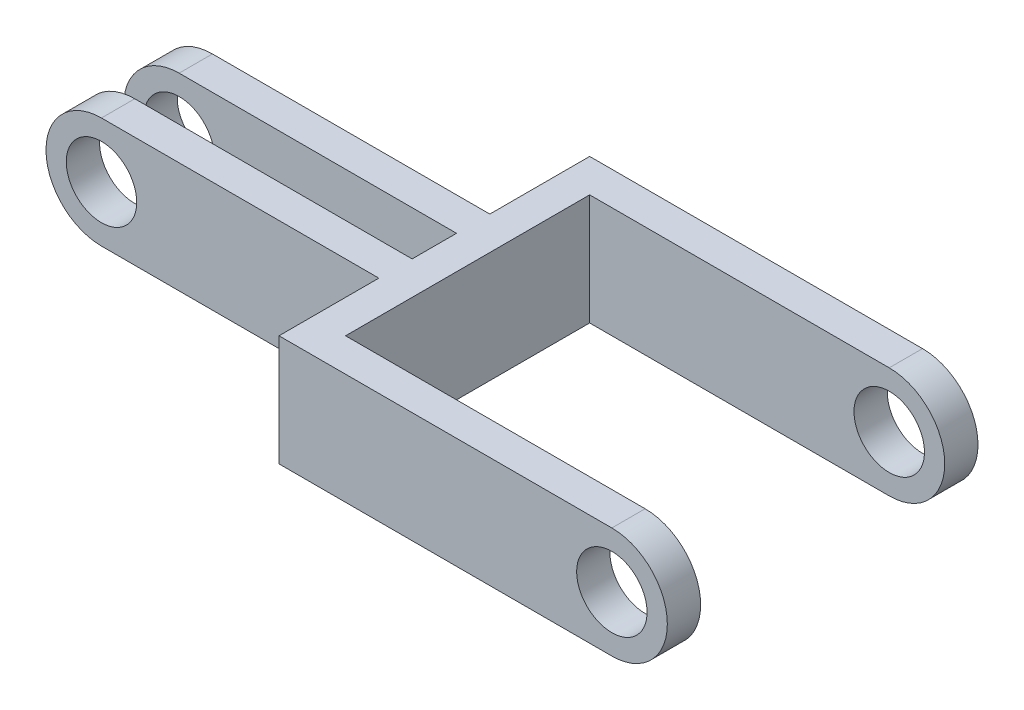
ISO-10303-21;
HEADER;
FILE_DESCRIPTION(('STEP AP214'),'2;1');
FILE_NAME('part.step','',(''),(''),'','','');
FILE_SCHEMA(('AUTOMOTIVE_DESIGN { 1 0 10303 214 1 1 1 1 }'));
ENDSEC;
DATA;
#1=APPLICATION_CONTEXT('core data for automotive mechanical design processes');
#2=APPLICATION_PROTOCOL_DEFINITION('international standard','automotive_design',2000,#1);
#3=PRODUCT_CONTEXT('',#1,'mechanical');
#4=PRODUCT('Part','Part','',(#3));
#5=PRODUCT_RELATED_PRODUCT_CATEGORY('part','',(#4));
#6=PRODUCT_DEFINITION_FORMATION('','',#4);
#7=PRODUCT_DEFINITION_CONTEXT('part definition',#1,'design');
#8=PRODUCT_DEFINITION('design','',#6,#7);
#9=PRODUCT_DEFINITION_SHAPE('','',#8);
#10=(LENGTH_UNIT() NAMED_UNIT(*) SI_UNIT(.MILLI.,.METRE.));
#11=(NAMED_UNIT(*) PLANE_ANGLE_UNIT() SI_UNIT($,.RADIAN.));
#12=(NAMED_UNIT(*) SI_UNIT($,.STERADIAN.) SOLID_ANGLE_UNIT());
#13=UNCERTAINTY_MEASURE_WITH_UNIT(LENGTH_MEASURE(1.E-05),#10,'distance_accuracy_value','');
#14=(GEOMETRIC_REPRESENTATION_CONTEXT(3) GLOBAL_UNCERTAINTY_ASSIGNED_CONTEXT((#13)) GLOBAL_UNIT_ASSIGNED_CONTEXT((#10,
#11,#12)) REPRESENTATION_CONTEXT('',''));
#15=CARTESIAN_POINT('',(0.,0.,0.));
#16=DIRECTION('',(0.,0.,1.));
#17=DIRECTION('',(1.,0.,0.));
#18=AXIS2_PLACEMENT_3D('',#15,#16,#17);
#19=CARTESIAN_POINT('',(25.,-8.54400374531753,3.));
#20=DIRECTION('',(-1.,0.,0.));
#21=DIRECTION('',(0.,0.,1.));
#22=AXIS2_PLACEMENT_3D('',#19,#20,#21);
#23=PLANE('',#22);
#24=DIRECTION('',(0.,0.,1.));
#25=VECTOR('',#24,1.);
#26=CARTESIAN_POINT('',(25.,10.,3.));
#27=LINE('',#26,#25);
#28=CARTESIAN_POINT('',(25.,10.,10.));
#29=VERTEX_POINT('',#28);
#30=CARTESIAN_POINT('',(25.,10.,19.));
#31=VERTEX_POINT('',#30);
#32=EDGE_CURVE('E225',#29,#31,#27,.T.);
#33=ORIENTED_EDGE('',*,*,#32,.F.);
#34=DIRECTION('',(0.,1.,0.));
#35=VECTOR('',#34,1.);
#36=CARTESIAN_POINT('',(25.,10.,10.));
#37=LINE('',#36,#35);
#38=CARTESIAN_POINT('',(25.,0.,10.));
#39=VERTEX_POINT('',#38);
#40=EDGE_CURVE('E219',#39,#29,#37,.T.);
#41=ORIENTED_EDGE('',*,*,#40,.F.);
#42=DIRECTION('',(0.,0.,-1.));
#43=VECTOR('',#42,1.);
#44=CARTESIAN_POINT('',(25.,0.,3.));
#45=LINE('',#44,#43);
#46=CARTESIAN_POINT('',(25.,0.,19.));
#47=VERTEX_POINT('',#46);
#48=EDGE_CURVE('E226',#47,#39,#45,.T.);
#49=ORIENTED_EDGE('',*,*,#48,.F.);
#50=DIRECTION('',(0.,1.,0.));
#51=VECTOR('',#50,1.);
#52=CARTESIAN_POINT('',(25.,0.,19.));
#53=LINE('',#52,#51);
#54=EDGE_CURVE('E160',#47,#31,#53,.T.);
#55=ORIENTED_EDGE('',*,*,#54,.T.);
#56=EDGE_LOOP('',(#33,#41,#49,#55));
#57=FACE_BOUND('',#56,.T.);
#58=ADVANCED_FACE('F35',(#57),#23,.T.);
#59=CARTESIAN_POINT('',(0.,5.,3.));
#60=DIRECTION('',(0.,0.,1.));
#61=DIRECTION('',(1.,0.,0.));
#62=AXIS2_PLACEMENT_3D('',#59,#60,#61);
#63=PLANE('',#62);
#64=CARTESIAN_POINT('',(0.,5.,3.));
#65=DIRECTION('',(0.,0.,1.));
#66=DIRECTION('',(1.,0.,0.));
#67=AXIS2_PLACEMENT_3D('',#64,#65,#66);
#68=CIRCLE('',#67,3.175);
#69=CARTESIAN_POINT('',(3.175,5.,3.));
#70=VERTEX_POINT('',#69);
#71=EDGE_CURVE('E275',#70,#70,#68,.T.);
#72=ORIENTED_EDGE('',*,*,#71,.F.);
#73=EDGE_LOOP('',(#72));
#74=FACE_BOUND('',#73,.T.);
#75=DIRECTION('',(1.,0.,0.));
#76=VECTOR('',#75,1.);
#77=CARTESIAN_POINT('',(0.,0.,3.));
#78=LINE('',#77,#76);
#79=CARTESIAN_POINT('',(0.,0.,3.));
#80=VERTEX_POINT('',#79);
#81=CARTESIAN_POINT('',(25.,0.,3.));
#82=VERTEX_POINT('',#81);
#83=EDGE_CURVE('E284',#80,#82,#78,.T.);
#84=ORIENTED_EDGE('',*,*,#83,.T.);
#85=DIRECTION('',(0.,1.,0.));
#86=VECTOR('',#85,1.);
#87=CARTESIAN_POINT('',(25.,-8.54400374531753,3.));
#88=LINE('',#87,#86);
#89=CARTESIAN_POINT('',(25.,10.,3.));
#90=VERTEX_POINT('',#89);
#91=EDGE_CURVE('E231',#82,#90,#88,.T.);
#92=ORIENTED_EDGE('',*,*,#91,.T.);
#93=DIRECTION('',(-1.,0.,0.));
#94=VECTOR('',#93,1.);
#95=CARTESIAN_POINT('',(0.,10.,3.));
#96=LINE('',#95,#94);
#97=CARTESIAN_POINT('',(0.,10.,3.));
#98=VERTEX_POINT('',#97);
#99=EDGE_CURVE('E288',#90,#98,#96,.T.);
#100=ORIENTED_EDGE('',*,*,#99,.T.);
#101=CARTESIAN_POINT('',(0.,5.,3.));
#102=DIRECTION('',(0.,0.,1.));
#103=DIRECTION('',(1.,0.,0.));
#104=AXIS2_PLACEMENT_3D('',#101,#102,#103);
#105=CIRCLE('',#104,5.);
#106=EDGE_CURVE('E281',#98,#80,#105,.T.);
#107=ORIENTED_EDGE('',*,*,#106,.T.);
#108=EDGE_LOOP('',(#84,#92,#100,#107));
#109=FACE_BOUND('',#108,.T.);
#110=ADVANCED_FACE('F313',(#74,#109),#63,.T.);
#111=CARTESIAN_POINT('',(0.,5.,0.));
#112=DIRECTION('',(0.,0.,1.));
#113=DIRECTION('',(1.,0.,0.));
#114=AXIS2_PLACEMENT_3D('',#111,#112,#113);
#115=PLANE('',#114);
#116=CARTESIAN_POINT('',(0.,5.,0.));
#117=DIRECTION('',(0.,0.,1.));
#118=DIRECTION('',(1.,0.,0.));
#119=AXIS2_PLACEMENT_3D('',#116,#117,#118);
#120=CIRCLE('',#119,5.);
#121=CARTESIAN_POINT('',(0.,10.,0.));
#122=VERTEX_POINT('',#121);
#123=CARTESIAN_POINT('',(0.,0.,0.));
#124=VERTEX_POINT('',#123);
#125=EDGE_CURVE('E278',#122,#124,#120,.T.);
#126=ORIENTED_EDGE('',*,*,#125,.F.);
#127=DIRECTION('',(-1.,0.,0.));
#128=VECTOR('',#127,1.);
#129=CARTESIAN_POINT('',(0.,10.,0.));
#130=LINE('',#129,#128);
#131=CARTESIAN_POINT('',(25.,10.,0.));
#132=VERTEX_POINT('',#131);
#133=EDGE_CURVE('E285',#132,#122,#130,.T.);
#134=ORIENTED_EDGE('',*,*,#133,.F.);
#135=DIRECTION('',(0.,1.,0.));
#136=VECTOR('',#135,1.);
#137=CARTESIAN_POINT('',(25.,10.,0.));
#138=LINE('',#137,#136);
#139=CARTESIAN_POINT('',(25.,0.,0.));
#140=VERTEX_POINT('',#139);
#141=EDGE_CURVE('E294',#140,#132,#138,.T.);
#142=ORIENTED_EDGE('',*,*,#141,.F.);
#143=DIRECTION('',(1.,0.,0.));
#144=VECTOR('',#143,1.);
#145=CARTESIAN_POINT('',(0.,0.,0.));
#146=LINE('',#145,#144);
#147=EDGE_CURVE('E292',#124,#140,#146,.T.);
#148=ORIENTED_EDGE('',*,*,#147,.F.);
#149=EDGE_LOOP('',(#126,#134,#142,#148));
#150=FACE_BOUND('',#149,.T.);
#151=CARTESIAN_POINT('',(0.,5.,0.));
#152=DIRECTION('',(0.,0.,1.));
#153=DIRECTION('',(1.,0.,0.));
#154=AXIS2_PLACEMENT_3D('',#151,#152,#153);
#155=CIRCLE('',#154,3.175);
#156=CARTESIAN_POINT('',(3.175,5.,0.));
#157=VERTEX_POINT('',#156);
#158=EDGE_CURVE('E272',#157,#157,#155,.T.);
#159=ORIENTED_EDGE('',*,*,#158,.T.);
#160=EDGE_LOOP('',(#159));
#161=FACE_BOUND('',#160,.T.);
#162=ADVANCED_FACE('F307',(#150,#161),#115,.F.);
#163=CARTESIAN_POINT('',(0.,5.,3.));
#164=DIRECTION('',(0.,0.,-1.));
#165=DIRECTION('',(-1.,0.,0.));
#166=AXIS2_PLACEMENT_3D('',#163,#164,#165);
#167=CYLINDRICAL_SURFACE('',#166,5.);
#168=ORIENTED_EDGE('',*,*,#125,.T.);
#169=DIRECTION('',(0.,0.,-1.));
#170=VECTOR('',#169,1.);
#171=CARTESIAN_POINT('',(0.,0.,3.));
#172=LINE('',#171,#170);
#173=EDGE_CURVE('E11',#80,#124,#172,.T.);
#174=ORIENTED_EDGE('',*,*,#173,.F.);
#175=ORIENTED_EDGE('',*,*,#106,.F.);
#176=DIRECTION('',(0.,0.,-1.));
#177=VECTOR('',#176,1.);
#178=CARTESIAN_POINT('',(0.,10.,3.));
#179=LINE('',#178,#177);
#180=EDGE_CURVE('E43',#98,#122,#179,.T.);
#181=ORIENTED_EDGE('',*,*,#180,.T.);
#182=EDGE_LOOP('',(#168,#174,#175,#181));
#183=FACE_BOUND('',#182,.T.);
#184=ADVANCED_FACE('F37',(#183),#167,.T.);
#185=CARTESIAN_POINT('',(0.,0.,3.));
#186=DIRECTION('',(0.,1.,0.));
#187=DIRECTION('',(0.,0.,1.));
#188=AXIS2_PLACEMENT_3D('',#185,#186,#187);
#189=PLANE('',#188);
#190=DIRECTION('',(0.,0.,-1.));
#191=VECTOR('',#190,1.);
#192=CARTESIAN_POINT('',(25.,0.,3.));
#193=LINE('',#192,#191);
#194=CARTESIAN_POINT('',(25.,0.,-9.));
#195=VERTEX_POINT('',#194);
#196=EDGE_CURVE('E263',#140,#195,#193,.T.);
#197=ORIENTED_EDGE('',*,*,#196,.T.);
#198=DIRECTION('',(-1.,0.,0.));
#199=VECTOR('',#198,1.);
#200=CARTESIAN_POINT('',(25.,0.,-9.));
#201=LINE('',#200,#199);
#202=CARTESIAN_POINT('',(55.,0.,-9.));
#203=VERTEX_POINT('',#202);
#204=EDGE_CURVE('E251',#203,#195,#201,.T.);
#205=ORIENTED_EDGE('',*,*,#204,.F.);
#206=DIRECTION('',(0.,0.,1.));
#207=VECTOR('',#206,1.);
#208=CARTESIAN_POINT('',(55.,0.,-9.));
#209=LINE('',#208,#207);
#210=CARTESIAN_POINT('',(55.,0.,-6.));
#211=VERTEX_POINT('',#210);
#212=EDGE_CURVE('E254',#203,#211,#209,.T.);
#213=ORIENTED_EDGE('',*,*,#212,.T.);
#214=DIRECTION('',(-1.,0.,0.));
#215=VECTOR('',#214,1.);
#216=CARTESIAN_POINT('',(25.,0.,-6.));
#217=LINE('',#216,#215);
#218=CARTESIAN_POINT('',(28.,0.,-6.));
#219=VERTEX_POINT('',#218);
#220=EDGE_CURVE('E249',#211,#219,#217,.T.);
#221=ORIENTED_EDGE('',*,*,#220,.T.);
#222=DIRECTION('',(0.,0.,-1.));
#223=VECTOR('',#222,1.);
#224=CARTESIAN_POINT('',(28.,0.,3.));
#225=LINE('',#224,#223);
#226=CARTESIAN_POINT('',(28.,0.,16.));
#227=VERTEX_POINT('',#226);
#228=EDGE_CURVE('E264',#227,#219,#225,.T.);
#229=ORIENTED_EDGE('',*,*,#228,.F.);
#230=DIRECTION('',(-1.,0.,0.));
#231=VECTOR('',#230,1.);
#232=CARTESIAN_POINT('',(25.,0.,16.));
#233=LINE('',#232,#231);
#234=CARTESIAN_POINT('',(55.,0.,16.));
#235=VERTEX_POINT('',#234);
#236=EDGE_CURVE('E169',#235,#227,#233,.T.);
#237=ORIENTED_EDGE('',*,*,#236,.F.);
#238=DIRECTION('',(0.,0.,-1.));
#239=VECTOR('',#238,1.);
#240=CARTESIAN_POINT('',(55.,0.,19.));
#241=LINE('',#240,#239);
#242=CARTESIAN_POINT('',(55.,0.,19.));
#243=VERTEX_POINT('',#242);
#244=EDGE_CURVE('E166',#243,#235,#241,.T.);
#245=ORIENTED_EDGE('',*,*,#244,.F.);
#246=DIRECTION('',(-1.,0.,0.));
#247=VECTOR('',#246,1.);
#248=CARTESIAN_POINT('',(25.,0.,19.));
#249=LINE('',#248,#247);
#250=EDGE_CURVE('E153',#243,#47,#249,.T.);
#251=ORIENTED_EDGE('',*,*,#250,.T.);
#252=ORIENTED_EDGE('',*,*,#48,.T.);
#253=DIRECTION('',(1.,0.,0.));
#254=VECTOR('',#253,1.);
#255=CARTESIAN_POINT('',(0.,0.,10.));
#256=LINE('',#255,#254);
#257=CARTESIAN_POINT('',(0.,0.,10.));
#258=VERTEX_POINT('',#257);
#259=EDGE_CURVE('E50',#258,#39,#256,.T.);
#260=ORIENTED_EDGE('',*,*,#259,.F.);
#261=DIRECTION('',(0.,0.,1.));
#262=VECTOR('',#261,1.);
#263=CARTESIAN_POINT('',(0.,0.,7.));
#264=LINE('',#263,#262);
#265=CARTESIAN_POINT('',(0.,0.,7.));
#266=VERTEX_POINT('',#265);
#267=EDGE_CURVE('E214',#266,#258,#264,.T.);
#268=ORIENTED_EDGE('',*,*,#267,.F.);
#269=DIRECTION('',(1.,0.,0.));
#270=VECTOR('',#269,1.);
#271=CARTESIAN_POINT('',(0.,0.,7.));
#272=LINE('',#271,#270);
#273=CARTESIAN_POINT('',(25.,0.,7.));
#274=VERTEX_POINT('',#273);
#275=EDGE_CURVE('E211',#266,#274,#272,.T.);
#276=ORIENTED_EDGE('',*,*,#275,.T.);
#277=EDGE_CURVE('E229',#274,#82,#45,.T.);
#278=ORIENTED_EDGE('',*,*,#277,.T.);
#279=ORIENTED_EDGE('',*,*,#83,.F.);
#280=ORIENTED_EDGE('',*,*,#173,.T.);
#281=ORIENTED_EDGE('',*,*,#147,.T.);
#282=EDGE_LOOP('',(#197,#205,#213,#221,#229,#237,#245,#251,#252,#260,#268,#276,#278,#279,#280,#281));
#283=FACE_BOUND('',#282,.T.);
#284=ADVANCED_FACE('F167',(#283),#189,.F.);
#285=CARTESIAN_POINT('',(0.,10.,3.));
#286=DIRECTION('',(0.,-1.,0.));
#287=DIRECTION('',(0.,0.,-1.));
#288=AXIS2_PLACEMENT_3D('',#285,#286,#287);
#289=PLANE('',#288);
#290=DIRECTION('',(1.,0.,0.));
#291=VECTOR('',#290,1.);
#292=CARTESIAN_POINT('',(25.,10.,16.));
#293=LINE('',#292,#291);
#294=CARTESIAN_POINT('',(28.,10.,16.));
#295=VERTEX_POINT('',#294);
#296=CARTESIAN_POINT('',(55.,10.,16.));
#297=VERTEX_POINT('',#296);
#298=EDGE_CURVE('E188',#295,#297,#293,.T.);
#299=ORIENTED_EDGE('',*,*,#298,.F.);
#300=DIRECTION('',(0.,0.,1.));
#301=VECTOR('',#300,1.);
#302=CARTESIAN_POINT('',(28.,10.,3.));
#303=LINE('',#302,#301);
#304=CARTESIAN_POINT('',(28.,10.,-6.));
#305=VERTEX_POINT('',#304);
#306=EDGE_CURVE('E270',#305,#295,#303,.T.);
#307=ORIENTED_EDGE('',*,*,#306,.F.);
#308=DIRECTION('',(1.,0.,0.));
#309=VECTOR('',#308,1.);
#310=CARTESIAN_POINT('',(25.,10.,-6.));
#311=LINE('',#310,#309);
#312=CARTESIAN_POINT('',(55.,10.,-6.));
#313=VERTEX_POINT('',#312);
#314=EDGE_CURVE('E242',#305,#313,#311,.T.);
#315=ORIENTED_EDGE('',*,*,#314,.T.);
#316=DIRECTION('',(0.,0.,1.));
#317=VECTOR('',#316,1.);
#318=CARTESIAN_POINT('',(55.,10.,-9.));
#319=LINE('',#318,#317);
#320=CARTESIAN_POINT('',(55.,10.,-9.));
#321=VERTEX_POINT('',#320);
#322=EDGE_CURVE('E260',#321,#313,#319,.T.);
#323=ORIENTED_EDGE('',*,*,#322,.F.);
#324=DIRECTION('',(1.,0.,0.));
#325=VECTOR('',#324,1.);
#326=CARTESIAN_POINT('',(25.,10.,-9.));
#327=LINE('',#326,#325);
#328=CARTESIAN_POINT('',(25.,10.,-9.));
#329=VERTEX_POINT('',#328);
#330=EDGE_CURVE('E248',#329,#321,#327,.T.);
#331=ORIENTED_EDGE('',*,*,#330,.F.);
#332=DIRECTION('',(0.,0.,1.));
#333=VECTOR('',#332,1.);
#334=CARTESIAN_POINT('',(25.,10.,3.));
#335=LINE('',#334,#333);
#336=EDGE_CURVE('E267',#329,#132,#335,.T.);
#337=ORIENTED_EDGE('',*,*,#336,.T.);
#338=ORIENTED_EDGE('',*,*,#133,.T.);
#339=ORIENTED_EDGE('',*,*,#180,.F.);
#340=ORIENTED_EDGE('',*,*,#99,.F.);
#341=CARTESIAN_POINT('',(25.,10.,7.));
#342=VERTEX_POINT('',#341);
#343=EDGE_CURVE('E58',#90,#342,#27,.T.);
#344=ORIENTED_EDGE('',*,*,#343,.T.);
#345=DIRECTION('',(-1.,0.,0.));
#346=VECTOR('',#345,1.);
#347=CARTESIAN_POINT('',(0.,10.,7.));
#348=LINE('',#347,#346);
#349=CARTESIAN_POINT('',(0.,10.,7.));
#350=VERTEX_POINT('',#349);
#351=EDGE_CURVE('E206',#342,#350,#348,.T.);
#352=ORIENTED_EDGE('',*,*,#351,.T.);
#353=DIRECTION('',(0.,0.,1.));
#354=VECTOR('',#353,1.);
#355=CARTESIAN_POINT('',(0.,10.,7.));
#356=LINE('',#355,#354);
#357=CARTESIAN_POINT('',(0.,10.,10.));
#358=VERTEX_POINT('',#357);
#359=EDGE_CURVE('E223',#350,#358,#356,.T.);
#360=ORIENTED_EDGE('',*,*,#359,.T.);
#361=DIRECTION('',(-1.,0.,0.));
#362=VECTOR('',#361,1.);
#363=CARTESIAN_POINT('',(0.,10.,10.));
#364=LINE('',#363,#362);
#365=EDGE_CURVE('E216',#29,#358,#364,.T.);
#366=ORIENTED_EDGE('',*,*,#365,.F.);
#367=ORIENTED_EDGE('',*,*,#32,.T.);
#368=DIRECTION('',(1.,0.,0.));
#369=VECTOR('',#368,1.);
#370=CARTESIAN_POINT('',(25.,10.,19.));
#371=LINE('',#370,#369);
#372=CARTESIAN_POINT('',(55.,10.,19.));
#373=VERTEX_POINT('',#372);
#374=EDGE_CURVE('E163',#31,#373,#371,.T.);
#375=ORIENTED_EDGE('',*,*,#374,.T.);
#376=DIRECTION('',(0.,0.,-1.));
#377=VECTOR('',#376,1.);
#378=CARTESIAN_POINT('',(55.,10.,19.));
#379=LINE('',#378,#377);
#380=EDGE_CURVE('E174',#373,#297,#379,.T.);
#381=ORIENTED_EDGE('',*,*,#380,.T.);
#382=EDGE_LOOP('',(#299,#307,#315,#323,#331,#337,#338,#339,#340,#344,#352,#360,#366,#367,#375,#381));
#383=FACE_BOUND('',#382,.T.);
#384=ADVANCED_FACE('F315',(#383),#289,.F.);
#385=CARTESIAN_POINT('',(0.,5.,3.));
#386=DIRECTION('',(0.,0.,-1.));
#387=DIRECTION('',(-1.,0.,0.));
#388=AXIS2_PLACEMENT_3D('',#385,#386,#387);
#389=CYLINDRICAL_SURFACE('',#388,3.175);
#390=ORIENTED_EDGE('',*,*,#71,.T.);
#391=EDGE_LOOP('',(#390));
#392=FACE_BOUND('',#391,.T.);
#393=ORIENTED_EDGE('',*,*,#158,.F.);
#394=EDGE_LOOP('',(#393));
#395=FACE_BOUND('',#394,.T.);
#396=ADVANCED_FACE('F403',(#392,#395),#389,.F.);
#397=CARTESIAN_POINT('',(28.,0.,0.));
#398=DIRECTION('',(-1.,0.,0.));
#399=DIRECTION('',(0.,0.,1.));
#400=AXIS2_PLACEMENT_3D('',#397,#398,#399);
#401=PLANE('',#400);
#402=ORIENTED_EDGE('',*,*,#228,.T.);
#403=DIRECTION('',(0.,1.,0.));
#404=VECTOR('',#403,1.);
#405=CARTESIAN_POINT('',(28.,0.,-6.));
#406=LINE('',#405,#404);
#407=EDGE_CURVE('E266',#219,#305,#406,.T.);
#408=ORIENTED_EDGE('',*,*,#407,.T.);
#409=ORIENTED_EDGE('',*,*,#306,.T.);
#410=DIRECTION('',(0.,1.,0.));
#411=VECTOR('',#410,1.);
#412=CARTESIAN_POINT('',(28.,0.,16.));
#413=LINE('',#412,#411);
#414=EDGE_CURVE('E173',#227,#295,#413,.T.);
#415=ORIENTED_EDGE('',*,*,#414,.F.);
#416=EDGE_LOOP('',(#402,#408,#409,#415));
#417=FACE_BOUND('',#416,.T.);
#418=ADVANCED_FACE('F381',(#417),#401,.F.);
#419=CARTESIAN_POINT('',(25.,0.,0.));
#420=DIRECTION('',(-1.,0.,0.));
#421=DIRECTION('',(0.,0.,1.));
#422=AXIS2_PLACEMENT_3D('',#419,#420,#421);
#423=PLANE('',#422);
#424=ORIENTED_EDGE('',*,*,#141,.T.);
#425=ORIENTED_EDGE('',*,*,#336,.F.);
#426=DIRECTION('',(0.,1.,0.));
#427=VECTOR('',#426,1.);
#428=CARTESIAN_POINT('',(25.,0.,-9.));
#429=LINE('',#428,#427);
#430=EDGE_CURVE('E245',#195,#329,#429,.T.);
#431=ORIENTED_EDGE('',*,*,#430,.F.);
#432=ORIENTED_EDGE('',*,*,#196,.F.);
#433=EDGE_LOOP('',(#424,#425,#431,#432));
#434=FACE_BOUND('',#433,.T.);
#435=ADVANCED_FACE('F394',(#434),#423,.T.);
#436=CARTESIAN_POINT('',(0.,0.,-9.));
#437=DIRECTION('',(0.,0.,-1.));
#438=DIRECTION('',(-1.,0.,0.));
#439=AXIS2_PLACEMENT_3D('',#436,#437,#438);
#440=PLANE('',#439);
#441=CARTESIAN_POINT('',(55.,5.,-9.));
#442=DIRECTION('',(0.,0.,-1.));
#443=DIRECTION('',(-1.,0.,0.));
#444=AXIS2_PLACEMENT_3D('',#441,#442,#443);
#445=CIRCLE('',#444,3.175);
#446=CARTESIAN_POINT('',(51.825,5.,-9.));
#447=VERTEX_POINT('',#446);
#448=EDGE_CURVE('E228',#447,#447,#445,.T.);
#449=ORIENTED_EDGE('',*,*,#448,.F.);
#450=EDGE_LOOP('',(#449));
#451=FACE_BOUND('',#450,.T.);
#452=ORIENTED_EDGE('',*,*,#430,.T.);
#453=ORIENTED_EDGE('',*,*,#330,.T.);
#454=CARTESIAN_POINT('',(55.,5.,-9.));
#455=DIRECTION('',(0.,0.,-1.));
#456=DIRECTION('',(-1.,0.,0.));
#457=AXIS2_PLACEMENT_3D('',#454,#455,#456);
#458=CIRCLE('',#457,5.);
#459=EDGE_CURVE('E236',#321,#203,#458,.T.);
#460=ORIENTED_EDGE('',*,*,#459,.T.);
#461=ORIENTED_EDGE('',*,*,#204,.T.);
#462=EDGE_LOOP('',(#452,#453,#460,#461));
#463=FACE_BOUND('',#462,.T.);
#464=ADVANCED_FACE('F392',(#451,#463),#440,.T.);
#465=CARTESIAN_POINT('',(0.,0.,-6.));
#466=DIRECTION('',(0.,0.,-1.));
#467=DIRECTION('',(-1.,0.,0.));
#468=AXIS2_PLACEMENT_3D('',#465,#466,#467);
#469=PLANE('',#468);
#470=CARTESIAN_POINT('',(55.,5.,-6.));
#471=DIRECTION('',(0.,0.,-1.));
#472=DIRECTION('',(-1.,0.,0.));
#473=AXIS2_PLACEMENT_3D('',#470,#471,#472);
#474=CIRCLE('',#473,3.175);
#475=CARTESIAN_POINT('',(51.825,5.,-6.));
#476=VERTEX_POINT('',#475);
#477=EDGE_CURVE('E233',#476,#476,#474,.T.);
#478=ORIENTED_EDGE('',*,*,#477,.T.);
#479=EDGE_LOOP('',(#478));
#480=FACE_BOUND('',#479,.T.);
#481=ORIENTED_EDGE('',*,*,#407,.F.);
#482=ORIENTED_EDGE('',*,*,#220,.F.);
#483=CARTESIAN_POINT('',(55.,5.,-6.));
#484=DIRECTION('',(0.,0.,-1.));
#485=DIRECTION('',(-1.,0.,0.));
#486=AXIS2_PLACEMENT_3D('',#483,#484,#485);
#487=CIRCLE('',#486,5.);
#488=EDGE_CURVE('E239',#211,#313,#487,.F.);
#489=ORIENTED_EDGE('',*,*,#488,.T.);
#490=ORIENTED_EDGE('',*,*,#314,.F.);
#491=EDGE_LOOP('',(#481,#482,#489,#490));
#492=FACE_BOUND('',#491,.T.);
#493=ADVANCED_FACE('F384',(#480,#492),#469,.F.);
#494=CARTESIAN_POINT('',(55.,5.,5.18033988749895));
#495=DIRECTION('',(0.,0.,-1.));
#496=DIRECTION('',(-1.,0.,0.));
#497=AXIS2_PLACEMENT_3D('',#494,#495,#496);
#498=CYLINDRICAL_SURFACE('',#497,5.);
#499=ORIENTED_EDGE('',*,*,#488,.F.);
#500=ORIENTED_EDGE('',*,*,#212,.F.);
#501=ORIENTED_EDGE('',*,*,#459,.F.);
#502=ORIENTED_EDGE('',*,*,#322,.T.);
#503=EDGE_LOOP('',(#499,#500,#501,#502));
#504=FACE_BOUND('',#503,.T.);
#505=ADVANCED_FACE('F332',(#504),#498,.T.);
#506=CARTESIAN_POINT('',(55.,5.,-6.));
#507=DIRECTION('',(0.,0.,-1.));
#508=DIRECTION('',(-1.,0.,0.));
#509=AXIS2_PLACEMENT_3D('',#506,#507,#508);
#510=CYLINDRICAL_SURFACE('',#509,3.175);
#511=ORIENTED_EDGE('',*,*,#477,.F.);
#512=EDGE_LOOP('',(#511));
#513=FACE_BOUND('',#512,.T.);
#514=ORIENTED_EDGE('',*,*,#448,.T.);
#515=EDGE_LOOP('',(#514));
#516=FACE_BOUND('',#515,.T.);
#517=ADVANCED_FACE('F324',(#513,#516),#510,.F.);
#518=DIRECTION('',(0.,1.,0.));
#519=VECTOR('',#518,1.);
#520=CARTESIAN_POINT('',(25.,10.,7.));
#521=LINE('',#520,#519);
#522=EDGE_CURVE('E209',#274,#342,#521,.T.);
#523=ORIENTED_EDGE('',*,*,#522,.T.);
#524=ORIENTED_EDGE('',*,*,#343,.F.);
#525=ORIENTED_EDGE('',*,*,#91,.F.);
#526=ORIENTED_EDGE('',*,*,#277,.F.);
#527=EDGE_LOOP('',(#523,#524,#525,#526));
#528=FACE_BOUND('',#527,.T.);
#529=ADVANCED_FACE('F321',(#528),#23,.T.);
#530=CARTESIAN_POINT('',(0.,5.,7.));
#531=DIRECTION('',(0.,0.,1.));
#532=DIRECTION('',(1.,0.,0.));
#533=AXIS2_PLACEMENT_3D('',#530,#531,#532);
#534=CYLINDRICAL_SURFACE('',#533,5.);
#535=CARTESIAN_POINT('',(0.,5.,10.));
#536=DIRECTION('',(0.,0.,1.));
#537=DIRECTION('',(1.,0.,0.));
#538=AXIS2_PLACEMENT_3D('',#535,#536,#537);
#539=CIRCLE('',#538,5.);
#540=EDGE_CURVE('E200',#358,#258,#539,.T.);
#541=ORIENTED_EDGE('',*,*,#540,.F.);
#542=ORIENTED_EDGE('',*,*,#359,.F.);
#543=CARTESIAN_POINT('',(0.,5.,7.));
#544=DIRECTION('',(0.,0.,1.));
#545=DIRECTION('',(1.,0.,0.));
#546=AXIS2_PLACEMENT_3D('',#543,#544,#545);
#547=CIRCLE('',#546,5.);
#548=EDGE_CURVE('E203',#350,#266,#547,.T.);
#549=ORIENTED_EDGE('',*,*,#548,.T.);
#550=ORIENTED_EDGE('',*,*,#267,.T.);
#551=EDGE_LOOP('',(#541,#542,#549,#550));
#552=FACE_BOUND('',#551,.T.);
#553=ADVANCED_FACE('F323',(#552),#534,.T.);
#554=CARTESIAN_POINT('',(0.,5.,7.));
#555=DIRECTION('',(0.,0.,-1.));
#556=DIRECTION('',(1.,0.,0.));
#557=AXIS2_PLACEMENT_3D('',#554,#555,#556);
#558=PLANE('',#557);
#559=CARTESIAN_POINT('',(0.,5.,7.));
#560=DIRECTION('',(0.,0.,1.));
#561=DIRECTION('',(1.,0.,0.));
#562=AXIS2_PLACEMENT_3D('',#559,#560,#561);
#563=CIRCLE('',#562,3.175);
#564=CARTESIAN_POINT('',(3.175,5.,7.));
#565=VERTEX_POINT('',#564);
#566=EDGE_CURVE('E197',#565,#565,#563,.T.);
#567=ORIENTED_EDGE('',*,*,#566,.T.);
#568=EDGE_LOOP('',(#567));
#569=FACE_BOUND('',#568,.T.);
#570=ORIENTED_EDGE('',*,*,#548,.F.);
#571=ORIENTED_EDGE('',*,*,#351,.F.);
#572=ORIENTED_EDGE('',*,*,#522,.F.);
#573=ORIENTED_EDGE('',*,*,#275,.F.);
#574=EDGE_LOOP('',(#570,#571,#572,#573));
#575=FACE_BOUND('',#574,.T.);
#576=ADVANCED_FACE('F319',(#569,#575),#558,.T.);
#577=CARTESIAN_POINT('',(0.,5.,10.));
#578=DIRECTION('',(0.,0.,-1.));
#579=DIRECTION('',(1.,0.,0.));
#580=AXIS2_PLACEMENT_3D('',#577,#578,#579);
#581=PLANE('',#580);
#582=CARTESIAN_POINT('',(0.,5.,10.));
#583=DIRECTION('',(0.,0.,1.));
#584=DIRECTION('',(1.,0.,0.));
#585=AXIS2_PLACEMENT_3D('',#582,#583,#584);
#586=CIRCLE('',#585,3.175);
#587=CARTESIAN_POINT('',(3.175,5.,10.));
#588=VERTEX_POINT('',#587);
#589=EDGE_CURVE('E196',#588,#588,#586,.T.);
#590=ORIENTED_EDGE('',*,*,#589,.F.);
#591=EDGE_LOOP('',(#590));
#592=FACE_BOUND('',#591,.T.);
#593=ORIENTED_EDGE('',*,*,#540,.T.);
#594=ORIENTED_EDGE('',*,*,#259,.T.);
#595=ORIENTED_EDGE('',*,*,#40,.T.);
#596=ORIENTED_EDGE('',*,*,#365,.T.);
#597=EDGE_LOOP('',(#593,#594,#595,#596));
#598=FACE_BOUND('',#597,.T.);
#599=ADVANCED_FACE('F343',(#592,#598),#581,.F.);
#600=CARTESIAN_POINT('',(0.,5.,7.));
#601=DIRECTION('',(0.,0.,1.));
#602=DIRECTION('',(1.,0.,0.));
#603=AXIS2_PLACEMENT_3D('',#600,#601,#602);
#604=CYLINDRICAL_SURFACE('',#603,3.175);
#605=ORIENTED_EDGE('',*,*,#566,.F.);
#606=EDGE_LOOP('',(#605));
#607=FACE_BOUND('',#606,.T.);
#608=ORIENTED_EDGE('',*,*,#589,.T.);
#609=EDGE_LOOP('',(#608));
#610=FACE_BOUND('',#609,.T.);
#611=ADVANCED_FACE('F345',(#607,#610),#604,.F.);
#612=CARTESIAN_POINT('',(0.,0.,16.));
#613=DIRECTION('',(0.,0.,1.));
#614=DIRECTION('',(-1.,0.,0.));
#615=AXIS2_PLACEMENT_3D('',#612,#613,#614);
#616=PLANE('',#615);
#617=CARTESIAN_POINT('',(55.,5.,16.));
#618=DIRECTION('',(0.,0.,-1.));
#619=DIRECTION('',(-1.,0.,0.));
#620=AXIS2_PLACEMENT_3D('',#617,#618,#619);
#621=CIRCLE('',#620,3.175);
#622=CARTESIAN_POINT('',(51.825,5.,16.));
#623=VERTEX_POINT('',#622);
#624=EDGE_CURVE('E180',#623,#623,#621,.T.);
#625=ORIENTED_EDGE('',*,*,#624,.F.);
#626=EDGE_LOOP('',(#625));
#627=FACE_BOUND('',#626,.T.);
#628=ORIENTED_EDGE('',*,*,#236,.T.);
#629=ORIENTED_EDGE('',*,*,#414,.T.);
#630=ORIENTED_EDGE('',*,*,#298,.T.);
#631=CARTESIAN_POINT('',(55.,5.,16.));
#632=DIRECTION('',(0.,0.,1.));
#633=DIRECTION('',(1.,0.,0.));
#634=AXIS2_PLACEMENT_3D('',#631,#632,#633);
#635=CIRCLE('',#634,5.);
#636=EDGE_CURVE('E179',#235,#297,#635,.T.);
#637=ORIENTED_EDGE('',*,*,#636,.F.);
#638=EDGE_LOOP('',(#628,#629,#630,#637));
#639=FACE_BOUND('',#638,.T.);
#640=ADVANCED_FACE('F352',(#627,#639),#616,.F.);
#641=CARTESIAN_POINT('',(0.,0.,19.));
#642=DIRECTION('',(0.,0.,1.));
#643=DIRECTION('',(-1.,0.,0.));
#644=AXIS2_PLACEMENT_3D('',#641,#642,#643);
#645=PLANE('',#644);
#646=CARTESIAN_POINT('',(55.,5.,19.));
#647=DIRECTION('',(0.,0.,-1.));
#648=DIRECTION('',(-1.,0.,0.));
#649=AXIS2_PLACEMENT_3D('',#646,#647,#648);
#650=CIRCLE('',#649,3.175);
#651=CARTESIAN_POINT('',(51.825,5.,19.));
#652=VERTEX_POINT('',#651);
#653=EDGE_CURVE('E184',#652,#652,#650,.T.);
#654=ORIENTED_EDGE('',*,*,#653,.T.);
#655=EDGE_LOOP('',(#654));
#656=FACE_BOUND('',#655,.T.);
#657=ORIENTED_EDGE('',*,*,#54,.F.);
#658=ORIENTED_EDGE('',*,*,#250,.F.);
#659=CARTESIAN_POINT('',(55.,5.,19.));
#660=DIRECTION('',(0.,0.,-1.));
#661=DIRECTION('',(-1.,0.,0.));
#662=AXIS2_PLACEMENT_3D('',#659,#660,#661);
#663=CIRCLE('',#662,5.);
#664=EDGE_CURVE('E158',#373,#243,#663,.T.);
#665=ORIENTED_EDGE('',*,*,#664,.F.);
#666=ORIENTED_EDGE('',*,*,#374,.F.);
#667=EDGE_LOOP('',(#657,#658,#665,#666));
#668=FACE_BOUND('',#667,.T.);
#669=ADVANCED_FACE('F155',(#656,#668),#645,.T.);
#670=CARTESIAN_POINT('',(55.,5.,-17.180339887499));
#671=DIRECTION('',(0.,0.,1.));
#672=DIRECTION('',(1.,0.,0.));
#673=AXIS2_PLACEMENT_3D('',#670,#671,#672);
#674=CYLINDRICAL_SURFACE('',#673,5.);
#675=ORIENTED_EDGE('',*,*,#244,.T.);
#676=ORIENTED_EDGE('',*,*,#636,.T.);
#677=ORIENTED_EDGE('',*,*,#380,.F.);
#678=ORIENTED_EDGE('',*,*,#664,.T.);
#679=EDGE_LOOP('',(#675,#676,#677,#678));
#680=FACE_BOUND('',#679,.T.);
#681=ADVANCED_FACE('F177',(#680),#674,.T.);
#682=CARTESIAN_POINT('',(55.,5.,16.));
#683=DIRECTION('',(0.,0.,1.));
#684=DIRECTION('',(1.,0.,0.));
#685=AXIS2_PLACEMENT_3D('',#682,#683,#684);
#686=CYLINDRICAL_SURFACE('',#685,3.175);
#687=ORIENTED_EDGE('',*,*,#624,.T.);
#688=EDGE_LOOP('',(#687));
#689=FACE_BOUND('',#688,.T.);
#690=ORIENTED_EDGE('',*,*,#653,.F.);
#691=EDGE_LOOP('',(#690));
#692=FACE_BOUND('',#691,.T.);
#693=ADVANCED_FACE('F367',(#689,#692),#686,.F.);
#694=CLOSED_SHELL('',(#58,#110,#162,#184,#284,#384,#396,#418,#435,#464,#493,#505,#517,#529,#553,
#576,#599,#611,#640,#669,#681,#693));
#695=MANIFOLD_SOLID_BREP('B2',#694);
#696=ADVANCED_BREP_SHAPE_REPRESENTATION('',(#18,#695),#14);
#697=SHAPE_DEFINITION_REPRESENTATION(#9,#696);
ENDSEC;
END-ISO-10303-21;
